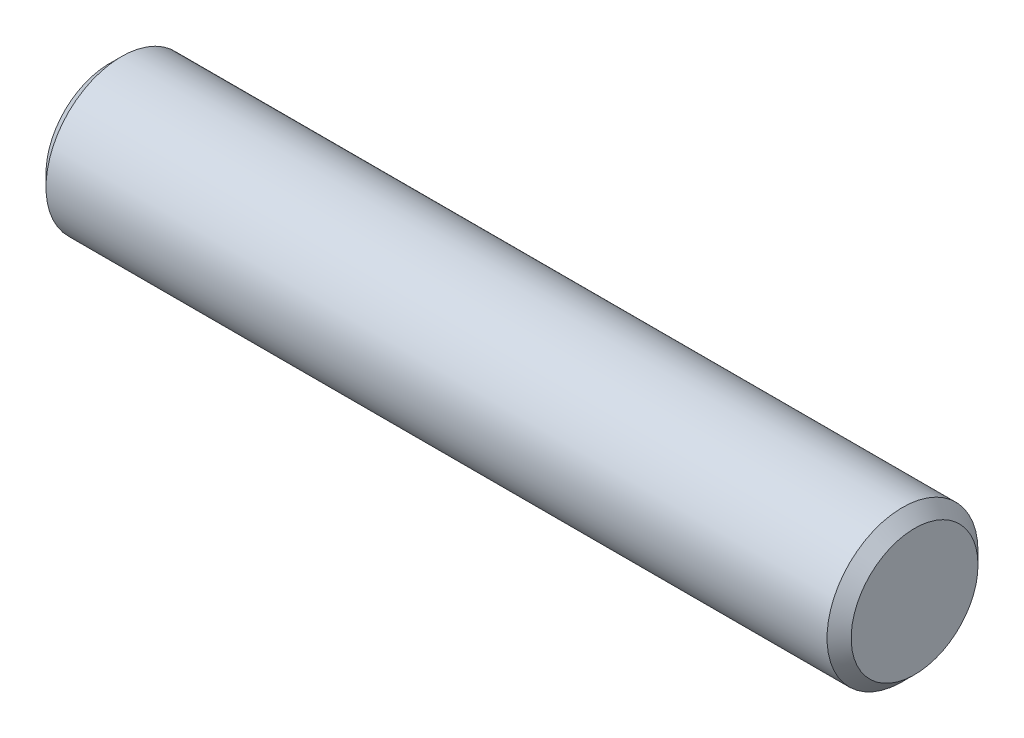
ISO-10303-21;
HEADER;
FILE_DESCRIPTION(('STEP AP214'),'2;1');
FILE_NAME('part.step','',(''),(''),'','','');
FILE_SCHEMA(('AUTOMOTIVE_DESIGN { 1 0 10303 214 1 1 1 1 }'));
ENDSEC;
DATA;
#1=APPLICATION_CONTEXT('core data for automotive mechanical design processes');
#2=APPLICATION_PROTOCOL_DEFINITION('international standard','automotive_design',2000,#1);
#3=PRODUCT_CONTEXT('',#1,'mechanical');
#4=PRODUCT('Part','Part','',(#3));
#5=PRODUCT_RELATED_PRODUCT_CATEGORY('part','',(#4));
#6=PRODUCT_DEFINITION_FORMATION('','',#4);
#7=PRODUCT_DEFINITION_CONTEXT('part definition',#1,'design');
#8=PRODUCT_DEFINITION('design','',#6,#7);
#9=PRODUCT_DEFINITION_SHAPE('','',#8);
#10=(LENGTH_UNIT() NAMED_UNIT(*) SI_UNIT(.MILLI.,.METRE.));
#11=(NAMED_UNIT(*) PLANE_ANGLE_UNIT() SI_UNIT($,.RADIAN.));
#12=(NAMED_UNIT(*) SI_UNIT($,.STERADIAN.) SOLID_ANGLE_UNIT());
#13=UNCERTAINTY_MEASURE_WITH_UNIT(LENGTH_MEASURE(1.E-05),#10,'distance_accuracy_value','');
#14=(GEOMETRIC_REPRESENTATION_CONTEXT(3) GLOBAL_UNCERTAINTY_ASSIGNED_CONTEXT((#13)) GLOBAL_UNIT_ASSIGNED_CONTEXT((#10,
#11,#12)) REPRESENTATION_CONTEXT('',''));
#15=CARTESIAN_POINT('',(0.,0.,0.));
#16=DIRECTION('',(0.,0.,1.));
#17=DIRECTION('',(1.,0.,0.));
#18=AXIS2_PLACEMENT_3D('',#15,#16,#17);
#19=CARTESIAN_POINT('',(25.4,0.,0.));
#20=DIRECTION('',(-1.,0.,0.));
#21=DIRECTION('',(0.,0.,1.));
#22=AXIS2_PLACEMENT_3D('',#19,#20,#21);
#23=CYLINDRICAL_SURFACE('',#22,2.38125);
#24=CARTESIAN_POINT('',(25.019,0.,0.));
#25=DIRECTION('',(1.,0.,0.));
#26=DIRECTION('',(0.,0.,-1.));
#27=AXIS2_PLACEMENT_3D('',#24,#25,#26);
#28=CIRCLE('',#27,2.38125);
#29=CARTESIAN_POINT('',(25.019,0.,-2.38125));
#30=VERTEX_POINT('',#29);
#31=EDGE_CURVE('E38',#30,#30,#28,.F.);
#32=ORIENTED_EDGE('',*,*,#31,.T.);
#33=EDGE_LOOP('',(#32));
#34=FACE_BOUND('',#33,.T.);
#35=CARTESIAN_POINT('',(0.381000000000002,0.,0.));
#36=DIRECTION('',(1.,0.,0.));
#37=DIRECTION('',(0.,0.,-1.));
#38=AXIS2_PLACEMENT_3D('',#35,#36,#37);
#39=CIRCLE('',#38,2.38125);
#40=CARTESIAN_POINT('',(0.381000000000001,0.,-2.38125));
#41=VERTEX_POINT('',#40);
#42=EDGE_CURVE('E42',#41,#41,#39,.T.);
#43=ORIENTED_EDGE('',*,*,#42,.T.);
#44=EDGE_LOOP('',(#43));
#45=FACE_BOUND('',#44,.T.);
#46=ADVANCED_FACE('F32',(#34,#45),#23,.T.);
#47=CARTESIAN_POINT('',(25.4,0.,0.));
#48=DIRECTION('',(1.,0.,0.));
#49=DIRECTION('',(0.,0.,-1.));
#50=AXIS2_PLACEMENT_3D('',#47,#48,#49);
#51=PLANE('',#50);
#52=CARTESIAN_POINT('',(25.4,0.,0.));
#53=DIRECTION('',(1.,0.,0.));
#54=DIRECTION('',(0.,0.,-1.));
#55=AXIS2_PLACEMENT_3D('',#52,#53,#54);
#56=CIRCLE('',#55,2.00025);
#57=CARTESIAN_POINT('',(25.4,0.,-2.00025));
#58=VERTEX_POINT('',#57);
#59=EDGE_CURVE('E46',#58,#58,#56,.T.);
#60=ORIENTED_EDGE('',*,*,#59,.T.);
#61=EDGE_LOOP('',(#60));
#62=FACE_BOUND('',#61,.T.);
#63=ADVANCED_FACE('F52',(#62),#51,.T.);
#64=CARTESIAN_POINT('',(0.,0.,0.));
#65=DIRECTION('',(1.,0.,0.));
#66=DIRECTION('',(0.,0.,-1.));
#67=AXIS2_PLACEMENT_3D('',#64,#65,#66);
#68=PLANE('',#67);
#69=CARTESIAN_POINT('',(0.,0.,0.));
#70=DIRECTION('',(1.,0.,0.));
#71=DIRECTION('',(0.,0.,-1.));
#72=AXIS2_PLACEMENT_3D('',#69,#70,#71);
#73=CIRCLE('',#72,2.00025);
#74=CARTESIAN_POINT('',(0.,0.,-2.00025));
#75=VERTEX_POINT('',#74);
#76=EDGE_CURVE('E10',#75,#75,#73,.F.);
#77=ORIENTED_EDGE('',*,*,#76,.T.);
#78=EDGE_LOOP('',(#77));
#79=FACE_BOUND('',#78,.T.);
#80=ADVANCED_FACE('F57',(#79),#68,.F.);
#81=CARTESIAN_POINT('',(25.4,0.,0.));
#82=DIRECTION('',(-1.,0.,0.));
#83=DIRECTION('',(0.,0.,1.));
#84=AXIS2_PLACEMENT_3D('',#81,#82,#83);
#85=CONICAL_SURFACE('',#84,2.00025,0.785398163397444);
#86=ORIENTED_EDGE('',*,*,#31,.F.);
#87=EDGE_LOOP('',(#86));
#88=FACE_BOUND('',#87,.T.);
#89=ORIENTED_EDGE('',*,*,#59,.F.);
#90=EDGE_LOOP('',(#89));
#91=FACE_BOUND('',#90,.T.);
#92=ADVANCED_FACE('F54',(#88,#91),#85,.T.);
#93=CARTESIAN_POINT('',(0.381000000000002,0.,0.));
#94=DIRECTION('',(1.,0.,0.));
#95=DIRECTION('',(0.,0.,-1.));
#96=AXIS2_PLACEMENT_3D('',#93,#94,#95);
#97=CONICAL_SURFACE('',#96,2.38125,0.78539816339745);
#98=CARTESIAN_POINT('',(0.,0.,-2.00025));
#99=CARTESIAN_POINT('',(0.00396874999999992,0.,-2.00421875));
#100=CARTESIAN_POINT('',(0.00793749999999996,0.,-2.0081875));
#101=CARTESIAN_POINT('',(0.015875,0.,-2.016125));
#102=CARTESIAN_POINT('',(0.0198437500000001,0.,-2.02009375));
#103=CARTESIAN_POINT('',(0.0277812500000001,0.,-2.02803125));
#104=CARTESIAN_POINT('',(0.0317500000000001,0.,-2.032));
#105=CARTESIAN_POINT('',(0.0396875000000002,0.,-2.0399375));
#106=CARTESIAN_POINT('',(0.0436562500000002,0.,-2.04390625));
#107=CARTESIAN_POINT('',(0.0515937500000002,0.,-2.05184375));
#108=CARTESIAN_POINT('',(0.0555625000000002,0.,-2.0558125));
#109=CARTESIAN_POINT('',(0.0635000000000002,0.,-2.06375));
#110=CARTESIAN_POINT('',(0.0674687500000003,0.,-2.06771875));
#111=CARTESIAN_POINT('',(0.0754062500000003,0.,-2.07565625));
#112=CARTESIAN_POINT('',(0.0793750000000003,0.,-2.079625));
#113=CARTESIAN_POINT('',(0.0873125000000003,0.,-2.0875625));
#114=CARTESIAN_POINT('',(0.0912812500000004,0.,-2.09153125));
#115=CARTESIAN_POINT('',(0.0992187500000004,0.,-2.09946875));
#116=CARTESIAN_POINT('',(0.1031875,0.,-2.1034375));
#117=CARTESIAN_POINT('',(0.111125,0.,-2.111375));
#118=CARTESIAN_POINT('',(0.11509375,0.,-2.11534375));
#119=CARTESIAN_POINT('',(0.123031250000001,0.,-2.12328125));
#120=CARTESIAN_POINT('',(0.127000000000001,0.,-2.12725));
#121=CARTESIAN_POINT('',(0.134937500000001,0.,-2.1351875));
#122=CARTESIAN_POINT('',(0.138906250000001,0.,-2.13915625));
#123=CARTESIAN_POINT('',(0.146843750000001,0.,-2.14709375));
#124=CARTESIAN_POINT('',(0.150812500000001,0.,-2.1510625));
#125=CARTESIAN_POINT('',(0.158750000000001,0.,-2.159));
#126=CARTESIAN_POINT('',(0.162718750000001,0.,-2.16296875));
#127=CARTESIAN_POINT('',(0.170656250000001,0.,-2.17090625));
#128=CARTESIAN_POINT('',(0.174625000000001,0.,-2.174875));
#129=CARTESIAN_POINT('',(0.182562500000001,0.,-2.1828125));
#130=CARTESIAN_POINT('',(0.186531250000001,0.,-2.18678125));
#131=CARTESIAN_POINT('',(0.194468750000001,0.,-2.19471875));
#132=CARTESIAN_POINT('',(0.198437500000001,0.,-2.1986875));
#133=CARTESIAN_POINT('',(0.206375000000001,0.,-2.206625));
#134=CARTESIAN_POINT('',(0.210343750000001,0.,-2.21059375));
#135=CARTESIAN_POINT('',(0.218281250000001,0.,-2.21853125));
#136=CARTESIAN_POINT('',(0.222250000000001,0.,-2.2225));
#137=CARTESIAN_POINT('',(0.230187500000001,0.,-2.2304375));
#138=CARTESIAN_POINT('',(0.234156250000001,0.,-2.23440625));
#139=CARTESIAN_POINT('',(0.242093750000001,0.,-2.24234375));
#140=CARTESIAN_POINT('',(0.246062500000001,0.,-2.2463125));
#141=CARTESIAN_POINT('',(0.254000000000001,0.,-2.25425));
#142=CARTESIAN_POINT('',(0.257968750000001,0.,-2.25821875));
#143=CARTESIAN_POINT('',(0.265906250000001,0.,-2.26615625));
#144=CARTESIAN_POINT('',(0.269875000000001,0.,-2.270125));
#145=CARTESIAN_POINT('',(0.277812500000001,0.,-2.2780625));
#146=CARTESIAN_POINT('',(0.281781250000001,0.,-2.28203125));
#147=CARTESIAN_POINT('',(0.289718750000001,0.,-2.28996875));
#148=CARTESIAN_POINT('',(0.293687500000001,0.,-2.2939375));
#149=CARTESIAN_POINT('',(0.301625000000001,0.,-2.301875));
#150=CARTESIAN_POINT('',(0.305593750000001,0.,-2.30584375));
#151=CARTESIAN_POINT('',(0.313531250000001,0.,-2.31378125));
#152=CARTESIAN_POINT('',(0.317500000000001,0.,-2.31775));
#153=CARTESIAN_POINT('',(0.325437500000001,0.,-2.3256875));
#154=CARTESIAN_POINT('',(0.329406250000001,0.,-2.32965625));
#155=CARTESIAN_POINT('',(0.337343750000001,0.,-2.33759375));
#156=CARTESIAN_POINT('',(0.341312500000001,0.,-2.3415625));
#157=CARTESIAN_POINT('',(0.349250000000001,0.,-2.3495));
#158=CARTESIAN_POINT('',(0.353218750000001,0.,-2.35346875));
#159=CARTESIAN_POINT('',(0.361156250000001,0.,-2.36140625));
#160=CARTESIAN_POINT('',(0.365125000000001,0.,-2.365375));
#161=CARTESIAN_POINT('',(0.373062500000001,0.,-2.3733125));
#162=CARTESIAN_POINT('',(0.377031250000001,0.,-2.37728125));
#163=CARTESIAN_POINT('',(0.381000000000001,0.,-2.38125));
#164=B_SPLINE_CURVE_WITH_KNOTS('',3,(#98,#99,#100,#101,#102,#103,#104,#105,#106,#107,#108,#109,
#110,#111,#112,#113,#114,#115,#116,#117,#118,#119,#120,#121,#122,#123,#124,#125,#126,#127,#128,
#129,#130,#131,#132,#133,#134,#135,#136,#137,#138,#139,#140,#141,#142,#143,#144,#145,#146,#147,
#148,#149,#150,#151,#152,#153,#154,#155,#156,#157,#158,#159,#160,#161,#162,#163),.UNSPECIFIED.,
.F.,.F.,(4,2,2,2,2,2,2,2,2,2,2,2,2,2,2,2,2,2,2,2,2,2,2,2,2,2,2,2,2,2,2,2,4),(0.,
0.0168379802270048,0.0336759604540094,0.0505139406810142,0.067351920908019,0.0841899011350239,
0.101027881362028,0.117865861589033,0.134703841816038,0.151541822043043,0.168379802270047,
0.185217782497052,0.202055762724057,0.218893742951062,0.235731723178066,0.252569703405071,
0.269407683632076,0.286245663859081,0.303083644086086,0.31992162431309,0.336759604540095,
0.3535975847671,0.370435564994105,0.387273545221109,0.404111525448114,0.420949505675119,
0.437787485902124,0.454625466129128,0.471463446356133,0.488301426583138,0.505139406810143,
0.521977387037147,0.538815367264152),.UNSPECIFIED.);
#165=EDGE_CURVE('BSEAM56',#75,#41,#164,.T.);
#166=ORIENTED_EDGE('',*,*,#76,.F.);
#167=ORIENTED_EDGE('',*,*,#42,.F.);
#168=ORIENTED_EDGE('',*,*,#165,.T.);
#169=ORIENTED_EDGE('',*,*,#165,.F.);
#170=EDGE_LOOP('',(#166,#168,#167,#169));
#171=FACE_BOUND('',#170,.T.);
#172=ADVANCED_FACE('F56',(#171),#97,.T.);
#173=CLOSED_SHELL('',(#46,#63,#80,#92,#172));
#174=MANIFOLD_SOLID_BREP('B2',#173);
#175=ADVANCED_BREP_SHAPE_REPRESENTATION('',(#18,#174),#14);
#176=SHAPE_DEFINITION_REPRESENTATION(#9,#175);
ENDSEC;
END-ISO-10303-21;
